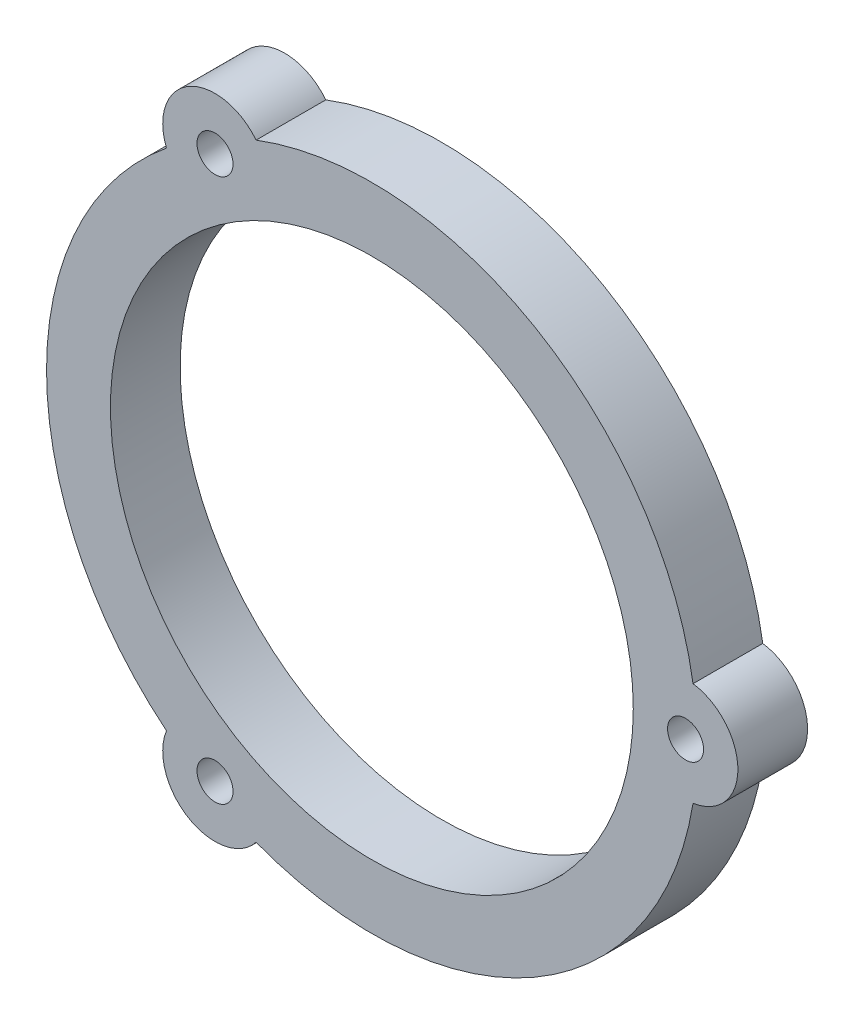
ISO-10303-21;
HEADER;
FILE_DESCRIPTION(('STEP AP214'),'2;1');
FILE_NAME('part.step','',(''),(''),'','','');
FILE_SCHEMA(('AUTOMOTIVE_DESIGN { 1 0 10303 214 1 1 1 1 }'));
ENDSEC;
DATA;
#1=APPLICATION_CONTEXT('core data for automotive mechanical design processes');
#2=APPLICATION_PROTOCOL_DEFINITION('international standard','automotive_design',2000,#1);
#3=PRODUCT_CONTEXT('',#1,'mechanical');
#4=PRODUCT('Part','Part','',(#3));
#5=PRODUCT_RELATED_PRODUCT_CATEGORY('part','',(#4));
#6=PRODUCT_DEFINITION_FORMATION('','',#4);
#7=PRODUCT_DEFINITION_CONTEXT('part definition',#1,'design');
#8=PRODUCT_DEFINITION('design','',#6,#7);
#9=PRODUCT_DEFINITION_SHAPE('','',#8);
#10=(LENGTH_UNIT() NAMED_UNIT(*) SI_UNIT(.MILLI.,.METRE.));
#11=(NAMED_UNIT(*) PLANE_ANGLE_UNIT() SI_UNIT($,.RADIAN.));
#12=(NAMED_UNIT(*) SI_UNIT($,.STERADIAN.) SOLID_ANGLE_UNIT());
#13=UNCERTAINTY_MEASURE_WITH_UNIT(LENGTH_MEASURE(1.E-05),#10,'distance_accuracy_value','');
#14=(GEOMETRIC_REPRESENTATION_CONTEXT(3) GLOBAL_UNCERTAINTY_ASSIGNED_CONTEXT((#13)) GLOBAL_UNIT_ASSIGNED_CONTEXT((#10,
#11,#12)) REPRESENTATION_CONTEXT('',''));
#15=CARTESIAN_POINT('',(0.,0.,0.));
#16=DIRECTION('',(0.,0.,1.));
#17=DIRECTION('',(1.,0.,0.));
#18=AXIS2_PLACEMENT_3D('',#15,#16,#17);
#19=CARTESIAN_POINT('',(51.5218629701621,19.8521076374618,6.));
#20=DIRECTION('',(0.,0.,-1.));
#21=DIRECTION('',(-1.,0.,0.));
#22=AXIS2_PLACEMENT_3D('',#19,#20,#21);
#23=CYLINDRICAL_SURFACE('',#22,28.);
#24=CARTESIAN_POINT('',(51.5218629701621,19.8521076374618,0.));
#25=DIRECTION('',(0.,0.,1.));
#26=DIRECTION('',(1.,0.,0.));
#27=AXIS2_PLACEMENT_3D('',#24,#25,#26);
#28=CIRCLE('',#27,28.);
#29=CARTESIAN_POINT('',(79.1653814886813,24.3058570597225,0.));
#30=VERTEX_POINT('',#29);
#31=CARTESIAN_POINT('',(41.5571638527896,46.0189716356607,0.));
#32=VERTEX_POINT('',#31);
#33=EDGE_CURVE('E39',#30,#32,#28,.T.);
#34=ORIENTED_EDGE('',*,*,#33,.T.);
#35=DIRECTION('',(0.,0.,1.));
#36=VECTOR('',#35,1.);
#37=CARTESIAN_POINT('',(41.5571638527896,46.0189716356607,3.));
#38=LINE('',#37,#36);
#39=CARTESIAN_POINT('',(41.5571638527896,46.0189716356607,6.));
#40=VERTEX_POINT('',#39);
#41=EDGE_CURVE('E88',#32,#40,#38,.T.);
#42=ORIENTED_EDGE('',*,*,#41,.T.);
#43=CARTESIAN_POINT('',(51.5218629701621,19.8521076374618,6.));
#44=DIRECTION('',(0.,0.,1.));
#45=DIRECTION('',(1.,0.,0.));
#46=AXIS2_PLACEMENT_3D('',#43,#44,#45);
#47=CIRCLE('',#46,28.);
#48=CARTESIAN_POINT('',(79.1653814886813,24.3058570597225,6.));
#49=VERTEX_POINT('',#48);
#50=EDGE_CURVE('E11',#49,#40,#47,.T.);
#51=ORIENTED_EDGE('',*,*,#50,.F.);
#52=DIRECTION('',(0.,0.,1.));
#53=VECTOR('',#52,1.);
#54=CARTESIAN_POINT('',(79.1653814886813,24.3058570597225,3.));
#55=LINE('',#54,#53);
#56=EDGE_CURVE('E113',#49,#30,#55,.F.);
#57=ORIENTED_EDGE('',*,*,#56,.T.);
#58=EDGE_LOOP('',(#34,#42,#51,#57));
#59=FACE_BOUND('',#58,.T.);
#60=ADVANCED_FACE('F35',(#59),#23,.T.);
#61=CARTESIAN_POINT('',(33.8430435690678,41.5652222133003,6.));
#62=VERTEX_POINT('',#61);
#63=CARTESIAN_POINT('',(33.8430435691882,-1.86100693847474,6.));
#64=VERTEX_POINT('',#63);
#65=EDGE_CURVE('E44',#62,#64,#47,.T.);
#66=ORIENTED_EDGE('',*,*,#65,.F.);
#67=DIRECTION('',(0.,0.,1.));
#68=VECTOR('',#67,1.);
#69=CARTESIAN_POINT('',(33.8430435690678,41.5652222133003,3.));
#70=LINE('',#69,#68);
#71=CARTESIAN_POINT('',(33.8430435690678,41.5652222133003,0.));
#72=VERTEX_POINT('',#71);
#73=EDGE_CURVE('E91',#62,#72,#70,.F.);
#74=ORIENTED_EDGE('',*,*,#73,.T.);
#75=CARTESIAN_POINT('',(33.8430435691882,-1.86100693847474,0.));
#76=VERTEX_POINT('',#75);
#77=EDGE_CURVE('E156',#72,#76,#28,.T.);
#78=ORIENTED_EDGE('',*,*,#77,.T.);
#79=DIRECTION('',(0.,0.,1.));
#80=VECTOR('',#79,1.);
#81=CARTESIAN_POINT('',(33.8430435691882,-1.86100693847474,3.));
#82=LINE('',#81,#80);
#83=EDGE_CURVE('E111',#76,#64,#82,.T.);
#84=ORIENTED_EDGE('',*,*,#83,.T.);
#85=EDGE_LOOP('',(#66,#74,#78,#84));
#86=FACE_BOUND('',#85,.T.);
#87=ADVANCED_FACE('F141',(#86),#23,.T.);
#88=CARTESIAN_POINT('',(41.5571638525672,-6.31475636065234,6.));
#89=VERTEX_POINT('',#88);
#90=CARTESIAN_POINT('',(79.1653814886944,15.3983582152822,6.));
#91=VERTEX_POINT('',#90);
#92=EDGE_CURVE('E45',#89,#91,#47,.T.);
#93=ORIENTED_EDGE('',*,*,#92,.F.);
#94=DIRECTION('',(0.,0.,1.));
#95=VECTOR('',#94,1.);
#96=CARTESIAN_POINT('',(41.5571638525672,-6.31475636065233,3.));
#97=LINE('',#96,#95);
#98=CARTESIAN_POINT('',(41.5571638525672,-6.31475636065233,0.));
#99=VERTEX_POINT('',#98);
#100=EDGE_CURVE('E159',#89,#99,#97,.F.);
#101=ORIENTED_EDGE('',*,*,#100,.T.);
#102=CARTESIAN_POINT('',(79.1653814886944,15.3983582152822,0.));
#103=VERTEX_POINT('',#102);
#104=EDGE_CURVE('E125',#99,#103,#28,.T.);
#105=ORIENTED_EDGE('',*,*,#104,.T.);
#106=DIRECTION('',(0.,0.,1.));
#107=VECTOR('',#106,1.);
#108=CARTESIAN_POINT('',(79.1653814886944,15.3983582152822,3.));
#109=LINE('',#108,#107);
#110=EDGE_CURVE('E116',#103,#91,#109,.T.);
#111=ORIENTED_EDGE('',*,*,#110,.T.);
#112=EDGE_LOOP('',(#93,#101,#105,#111));
#113=FACE_BOUND('',#112,.T.);
#114=ADVANCED_FACE('F37',(#113),#23,.T.);
#115=CARTESIAN_POINT('',(51.5218629701621,19.8521076374618,6.));
#116=DIRECTION('',(0.,0.,1.));
#117=DIRECTION('',(1.,0.,0.));
#118=AXIS2_PLACEMENT_3D('',#115,#116,#117);
#119=PLANE('',#118);
#120=CARTESIAN_POINT('',(38.0218629701622,43.2347935396813,6.));
#121=DIRECTION('',(0.,0.,1.));
#122=DIRECTION('',(1.,0.,0.));
#123=AXIS2_PLACEMENT_3D('',#120,#121,#122);
#124=CIRCLE('',#123,1.54999999999999);
#125=CARTESIAN_POINT('',(39.5718629701622,43.2347935396813,6.));
#126=VERTEX_POINT('',#125);
#127=EDGE_CURVE('E252',#126,#126,#124,.T.);
#128=ORIENTED_EDGE('',*,*,#127,.F.);
#129=EDGE_LOOP('',(#128));
#130=FACE_BOUND('',#129,.T.);
#131=CARTESIAN_POINT('',(38.021862970162,-3.53057826467831,6.));
#132=DIRECTION('',(0.,0.,1.));
#133=DIRECTION('',(1.,0.,0.));
#134=AXIS2_PLACEMENT_3D('',#131,#132,#133);
#135=CIRCLE('',#134,1.55);
#136=CARTESIAN_POINT('',(39.571862970162,-3.53057826467831,6.));
#137=VERTEX_POINT('',#136);
#138=EDGE_CURVE('E254',#137,#137,#135,.T.);
#139=ORIENTED_EDGE('',*,*,#138,.F.);
#140=EDGE_LOOP('',(#139));
#141=FACE_BOUND('',#140,.T.);
#142=CARTESIAN_POINT('',(78.5218629701622,19.8521076375014,6.));
#143=DIRECTION('',(0.,0.,1.));
#144=DIRECTION('',(1.,0.,0.));
#145=AXIS2_PLACEMENT_3D('',#142,#143,#144);
#146=CIRCLE('',#145,1.55000000000001);
#147=CARTESIAN_POINT('',(80.0718629701622,19.8521076375014,6.));
#148=VERTEX_POINT('',#147);
#149=EDGE_CURVE('E165',#148,#148,#146,.T.);
#150=ORIENTED_EDGE('',*,*,#149,.F.);
#151=EDGE_LOOP('',(#150));
#152=FACE_BOUND('',#151,.T.);
#153=CARTESIAN_POINT('',(51.5218629701622,19.8521076374618,6.));
#154=DIRECTION('',(0.,0.,1.));
#155=DIRECTION('',(1.,0.,0.));
#156=AXIS2_PLACEMENT_3D('',#153,#154,#155);
#157=CIRCLE('',#156,22.5);
#158=CARTESIAN_POINT('',(74.0218629701621,19.8521076374618,6.));
#159=VERTEX_POINT('',#158);
#160=EDGE_CURVE('E118',#159,#159,#157,.T.);
#161=ORIENTED_EDGE('',*,*,#160,.F.);
#162=EDGE_LOOP('',(#161));
#163=FACE_BOUND('',#162,.T.);
#164=ORIENTED_EDGE('',*,*,#50,.T.);
#165=CARTESIAN_POINT('',(38.0218629701622,43.2347935396813,6.));
#166=DIRECTION('',(0.,0.,1.));
#167=DIRECTION('',(1.,0.,0.));
#168=AXIS2_PLACEMENT_3D('',#165,#166,#167);
#169=CIRCLE('',#168,4.50000000009302);
#170=EDGE_CURVE('E51',#40,#62,#169,.T.);
#171=ORIENTED_EDGE('',*,*,#170,.T.);
#172=ORIENTED_EDGE('',*,*,#65,.T.);
#173=CARTESIAN_POINT('',(38.021862970162,-3.53057826467831,6.));
#174=DIRECTION('',(0.,0.,1.));
#175=DIRECTION('',(1.,0.,0.));
#176=AXIS2_PLACEMENT_3D('',#173,#174,#175);
#177=CIRCLE('',#176,4.49999999991513);
#178=EDGE_CURVE('E57',#64,#89,#177,.T.);
#179=ORIENTED_EDGE('',*,*,#178,.T.);
#180=ORIENTED_EDGE('',*,*,#92,.T.);
#181=CARTESIAN_POINT('',(78.5218629701622,19.8521076375014,6.));
#182=DIRECTION('',(0.,0.,1.));
#183=DIRECTION('',(1.,0.,0.));
#184=AXIS2_PLACEMENT_3D('',#181,#182,#183);
#185=CIRCLE('',#184,4.49999999995686);
#186=EDGE_CURVE('E104',#91,#49,#185,.T.);
#187=ORIENTED_EDGE('',*,*,#186,.T.);
#188=EDGE_LOOP('',(#164,#171,#172,#179,#180,#187));
#189=FACE_BOUND('',#188,.T.);
#190=ADVANCED_FACE('F102',(#130,#141,#152,#163,#189),#119,.T.);
#191=CARTESIAN_POINT('',(51.5218629701621,19.8521076374618,0.));
#192=DIRECTION('',(0.,0.,1.));
#193=DIRECTION('',(1.,0.,0.));
#194=AXIS2_PLACEMENT_3D('',#191,#192,#193);
#195=PLANE('',#194);
#196=CARTESIAN_POINT('',(38.0218629701622,43.2347935396813,0.));
#197=DIRECTION('',(0.,0.,1.));
#198=DIRECTION('',(1.,0.,0.));
#199=AXIS2_PLACEMENT_3D('',#196,#197,#198);
#200=CIRCLE('',#199,1.54999999999999);
#201=CARTESIAN_POINT('',(39.5718629701622,43.2347935396813,0.));
#202=VERTEX_POINT('',#201);
#203=EDGE_CURVE('E250',#202,#202,#200,.T.);
#204=ORIENTED_EDGE('',*,*,#203,.T.);
#205=EDGE_LOOP('',(#204));
#206=FACE_BOUND('',#205,.T.);
#207=CARTESIAN_POINT('',(38.021862970162,-3.53057826467831,0.));
#208=DIRECTION('',(0.,0.,1.));
#209=DIRECTION('',(1.,0.,0.));
#210=AXIS2_PLACEMENT_3D('',#207,#208,#209);
#211=CIRCLE('',#210,1.55);
#212=CARTESIAN_POINT('',(39.571862970162,-3.53057826467831,0.));
#213=VERTEX_POINT('',#212);
#214=EDGE_CURVE('E257',#213,#213,#211,.T.);
#215=ORIENTED_EDGE('',*,*,#214,.T.);
#216=EDGE_LOOP('',(#215));
#217=FACE_BOUND('',#216,.T.);
#218=CARTESIAN_POINT('',(78.5218629701622,19.8521076375014,0.));
#219=DIRECTION('',(0.,0.,1.));
#220=DIRECTION('',(1.,0.,0.));
#221=AXIS2_PLACEMENT_3D('',#218,#219,#220);
#222=CIRCLE('',#221,1.55000000000001);
#223=CARTESIAN_POINT('',(80.0718629701622,19.8521076375014,0.));
#224=VERTEX_POINT('',#223);
#225=EDGE_CURVE('E94',#224,#224,#222,.T.);
#226=ORIENTED_EDGE('',*,*,#225,.T.);
#227=EDGE_LOOP('',(#226));
#228=FACE_BOUND('',#227,.T.);
#229=CARTESIAN_POINT('',(51.5218629701622,19.8521076374618,0.));
#230=DIRECTION('',(0.,0.,1.));
#231=DIRECTION('',(1.,0.,0.));
#232=AXIS2_PLACEMENT_3D('',#229,#230,#231);
#233=CIRCLE('',#232,22.5);
#234=CARTESIAN_POINT('',(74.0218629701621,19.8521076374618,0.));
#235=VERTEX_POINT('',#234);
#236=EDGE_CURVE('E122',#235,#235,#233,.T.);
#237=ORIENTED_EDGE('',*,*,#236,.T.);
#238=EDGE_LOOP('',(#237));
#239=FACE_BOUND('',#238,.T.);
#240=ORIENTED_EDGE('',*,*,#77,.F.);
#241=CARTESIAN_POINT('',(38.0218629701622,43.2347935396813,0.));
#242=DIRECTION('',(0.,0.,1.));
#243=DIRECTION('',(1.,0.,0.));
#244=AXIS2_PLACEMENT_3D('',#241,#242,#243);
#245=CIRCLE('',#244,4.50000000009302);
#246=EDGE_CURVE('E93',#32,#72,#245,.T.);
#247=ORIENTED_EDGE('',*,*,#246,.F.);
#248=ORIENTED_EDGE('',*,*,#33,.F.);
#249=CARTESIAN_POINT('',(78.5218629701622,19.8521076375014,0.));
#250=DIRECTION('',(0.,0.,1.));
#251=DIRECTION('',(1.,0.,0.));
#252=AXIS2_PLACEMENT_3D('',#249,#250,#251);
#253=CIRCLE('',#252,4.49999999995686);
#254=EDGE_CURVE('E110',#103,#30,#253,.T.);
#255=ORIENTED_EDGE('',*,*,#254,.F.);
#256=ORIENTED_EDGE('',*,*,#104,.F.);
#257=CARTESIAN_POINT('',(38.021862970162,-3.53057826467831,0.));
#258=DIRECTION('',(0.,0.,1.));
#259=DIRECTION('',(1.,0.,0.));
#260=AXIS2_PLACEMENT_3D('',#257,#258,#259);
#261=CIRCLE('',#260,4.49999999991513);
#262=EDGE_CURVE('E168',#76,#99,#261,.T.);
#263=ORIENTED_EDGE('',*,*,#262,.F.);
#264=EDGE_LOOP('',(#240,#247,#248,#255,#256,#263));
#265=FACE_BOUND('',#264,.T.);
#266=ADVANCED_FACE('F133',(#206,#217,#228,#239,#265),#195,.F.);
#267=CARTESIAN_POINT('',(51.5218629701622,19.8521076374618,0.));
#268=DIRECTION('',(0.,0.,1.));
#269=DIRECTION('',(1.,0.,0.));
#270=AXIS2_PLACEMENT_3D('',#267,#268,#269);
#271=CYLINDRICAL_SURFACE('',#270,22.5);
#272=ORIENTED_EDGE('',*,*,#160,.T.);
#273=EDGE_LOOP('',(#272));
#274=FACE_BOUND('',#273,.T.);
#275=ORIENTED_EDGE('',*,*,#236,.F.);
#276=EDGE_LOOP('',(#275));
#277=FACE_BOUND('',#276,.T.);
#278=ADVANCED_FACE('F129',(#274,#277),#271,.F.);
#279=CARTESIAN_POINT('',(78.5218629701622,19.8521076375014,0.));
#280=DIRECTION('',(0.,0.,1.));
#281=DIRECTION('',(1.,0.,0.));
#282=AXIS2_PLACEMENT_3D('',#279,#280,#281);
#283=CYLINDRICAL_SURFACE('',#282,4.49999999995686);
#284=ORIENTED_EDGE('',*,*,#110,.F.);
#285=ORIENTED_EDGE('',*,*,#254,.T.);
#286=ORIENTED_EDGE('',*,*,#56,.F.);
#287=ORIENTED_EDGE('',*,*,#186,.F.);
#288=EDGE_LOOP('',(#284,#285,#286,#287));
#289=FACE_BOUND('',#288,.T.);
#290=ADVANCED_FACE('F114',(#289),#283,.T.);
#291=CARTESIAN_POINT('',(38.021862970162,-3.53057826467831,0.));
#292=DIRECTION('',(0.,0.,1.));
#293=DIRECTION('',(1.,0.,0.));
#294=AXIS2_PLACEMENT_3D('',#291,#292,#293);
#295=CYLINDRICAL_SURFACE('',#294,4.49999999991513);
#296=ORIENTED_EDGE('',*,*,#83,.F.);
#297=ORIENTED_EDGE('',*,*,#262,.T.);
#298=ORIENTED_EDGE('',*,*,#100,.F.);
#299=ORIENTED_EDGE('',*,*,#178,.F.);
#300=EDGE_LOOP('',(#296,#297,#298,#299));
#301=FACE_BOUND('',#300,.T.);
#302=ADVANCED_FACE('F173',(#301),#295,.T.);
#303=CARTESIAN_POINT('',(38.0218629701622,43.2347935396813,0.));
#304=DIRECTION('',(0.,0.,1.));
#305=DIRECTION('',(1.,0.,0.));
#306=AXIS2_PLACEMENT_3D('',#303,#304,#305);
#307=CYLINDRICAL_SURFACE('',#306,4.50000000009302);
#308=ORIENTED_EDGE('',*,*,#41,.F.);
#309=ORIENTED_EDGE('',*,*,#246,.T.);
#310=ORIENTED_EDGE('',*,*,#73,.F.);
#311=ORIENTED_EDGE('',*,*,#170,.F.);
#312=EDGE_LOOP('',(#308,#309,#310,#311));
#313=FACE_BOUND('',#312,.T.);
#314=ADVANCED_FACE('F87',(#313),#307,.T.);
#315=CARTESIAN_POINT('',(78.5218629701622,19.8521076375014,0.));
#316=DIRECTION('',(0.,0.,1.));
#317=DIRECTION('',(1.,0.,0.));
#318=AXIS2_PLACEMENT_3D('',#315,#316,#317);
#319=CYLINDRICAL_SURFACE('',#318,1.55000000000001);
#320=ORIENTED_EDGE('',*,*,#225,.F.);
#321=EDGE_LOOP('',(#320));
#322=FACE_BOUND('',#321,.T.);
#323=ORIENTED_EDGE('',*,*,#149,.T.);
#324=EDGE_LOOP('',(#323));
#325=FACE_BOUND('',#324,.T.);
#326=ADVANCED_FACE('F180',(#322,#325),#319,.F.);
#327=CARTESIAN_POINT('',(38.021862970162,-3.53057826467831,0.));
#328=DIRECTION('',(0.,0.,1.));
#329=DIRECTION('',(1.,0.,0.));
#330=AXIS2_PLACEMENT_3D('',#327,#328,#329);
#331=CYLINDRICAL_SURFACE('',#330,1.55);
#332=ORIENTED_EDGE('',*,*,#214,.F.);
#333=EDGE_LOOP('',(#332));
#334=FACE_BOUND('',#333,.T.);
#335=ORIENTED_EDGE('',*,*,#138,.T.);
#336=EDGE_LOOP('',(#335));
#337=FACE_BOUND('',#336,.T.);
#338=ADVANCED_FACE('F224',(#334,#337),#331,.F.);
#339=CARTESIAN_POINT('',(38.0218629701622,43.2347935396813,0.));
#340=DIRECTION('',(0.,0.,1.));
#341=DIRECTION('',(1.,0.,0.));
#342=AXIS2_PLACEMENT_3D('',#339,#340,#341);
#343=CYLINDRICAL_SURFACE('',#342,1.54999999999999);
#344=ORIENTED_EDGE('',*,*,#203,.F.);
#345=EDGE_LOOP('',(#344));
#346=FACE_BOUND('',#345,.T.);
#347=ORIENTED_EDGE('',*,*,#127,.T.);
#348=EDGE_LOOP('',(#347));
#349=FACE_BOUND('',#348,.T.);
#350=ADVANCED_FACE('F233',(#346,#349),#343,.F.);
#351=CLOSED_SHELL('',(#60,#87,#114,#190,#266,#278,#290,#302,#314,#326,#338,#350));
#352=MANIFOLD_SOLID_BREP('B2',#351);
#353=ADVANCED_BREP_SHAPE_REPRESENTATION('',(#18,#352),#14);
#354=SHAPE_DEFINITION_REPRESENTATION(#9,#353);
ENDSEC;
END-ISO-10303-21;
